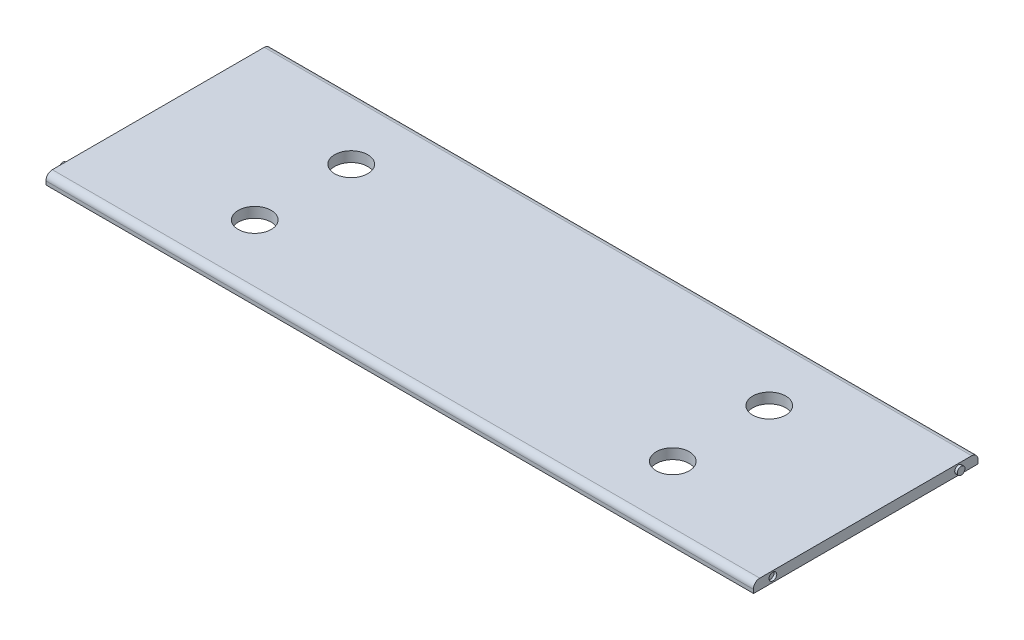
ISO-10303-21;
HEADER;
FILE_DESCRIPTION(('STEP AP214'),'2;1');
FILE_NAME('part.step','',(''),(''),'','','');
FILE_SCHEMA(('AUTOMOTIVE_DESIGN { 1 0 10303 214 1 1 1 1 }'));
ENDSEC;
DATA;
#1=APPLICATION_CONTEXT('core data for automotive mechanical design processes');
#2=APPLICATION_PROTOCOL_DEFINITION('international standard','automotive_design',2000,#1);
#3=PRODUCT_CONTEXT('',#1,'mechanical');
#4=PRODUCT('Part','Part','',(#3));
#5=PRODUCT_RELATED_PRODUCT_CATEGORY('part','',(#4));
#6=PRODUCT_DEFINITION_FORMATION('','',#4);
#7=PRODUCT_DEFINITION_CONTEXT('part definition',#1,'design');
#8=PRODUCT_DEFINITION('design','',#6,#7);
#9=PRODUCT_DEFINITION_SHAPE('','',#8);
#10=(LENGTH_UNIT() NAMED_UNIT(*) SI_UNIT(.MILLI.,.METRE.));
#11=(NAMED_UNIT(*) PLANE_ANGLE_UNIT() SI_UNIT($,.RADIAN.));
#12=(NAMED_UNIT(*) SI_UNIT($,.STERADIAN.) SOLID_ANGLE_UNIT());
#13=UNCERTAINTY_MEASURE_WITH_UNIT(LENGTH_MEASURE(1.E-05),#10,'distance_accuracy_value','');
#14=(GEOMETRIC_REPRESENTATION_CONTEXT(3) GLOBAL_UNCERTAINTY_ASSIGNED_CONTEXT((#13)) GLOBAL_UNIT_ASSIGNED_CONTEXT((#10,
#11,#12)) REPRESENTATION_CONTEXT('',''));
#15=CARTESIAN_POINT('',(0.,0.,0.));
#16=DIRECTION('',(0.,0.,1.));
#17=DIRECTION('',(1.,0.,0.));
#18=AXIS2_PLACEMENT_3D('',#15,#16,#17);
#19=CARTESIAN_POINT('',(-254.,215.9,22.225));
#20=DIRECTION('',(0.,0.0416305447121813,-0.999133073092352));
#21=DIRECTION('',(0.,0.999133073092352,0.0416305447121813));
#22=AXIS2_PLACEMENT_3D('',#19,#20,#21);
#23=PLANE('',#22);
#24=DIRECTION('',(0.,0.999133073092352,0.0416305447121813));
#25=VECTOR('',#24,1.);
#26=CARTESIAN_POINT('',(-69.85,215.899999999997,22.2249999999999));
#27=LINE('',#26,#25);
#28=CARTESIAN_POINT('',(-69.85,213.868,22.1403333333333));
#29=VERTEX_POINT('',#28);
#30=CARTESIAN_POINT('',(-69.85,214.603586624051,22.1709827760021));
#31=VERTEX_POINT('',#30);
#32=EDGE_CURVE('E60',#29,#31,#27,.T.);
#33=ORIENTED_EDGE('',*,*,#32,.F.);
#34=DIRECTION('',(1.,0.,0.));
#35=VECTOR('',#34,1.);
#36=CARTESIAN_POINT('',(0.,213.868,22.1403333333333));
#37=LINE('',#36,#35);
#38=CARTESIAN_POINT('',(69.8500000000001,213.868,22.1403333333333));
#39=VERTEX_POINT('',#38);
#40=EDGE_CURVE('E118',#29,#39,#37,.T.);
#41=ORIENTED_EDGE('',*,*,#40,.T.);
#42=DIRECTION('',(0.,-0.999133073092352,-0.0416305447121813));
#43=VECTOR('',#42,1.);
#44=CARTESIAN_POINT('',(69.85,215.900000000004,22.2250000000002));
#45=LINE('',#44,#43);
#46=CARTESIAN_POINT('',(69.85,214.603586624051,22.1709827760021));
#47=VERTEX_POINT('',#46);
#48=EDGE_CURVE('E135',#47,#39,#45,.T.);
#49=ORIENTED_EDGE('',*,*,#48,.F.);
#50=DIRECTION('',(-1.,0.,0.));
#51=VECTOR('',#50,1.);
#52=CARTESIAN_POINT('',(-254.,214.603586624051,22.1709827760021));
#53=LINE('',#52,#51);
#54=EDGE_CURVE('E109',#47,#31,#53,.T.);
#55=ORIENTED_EDGE('',*,*,#54,.T.);
#56=EDGE_LOOP('',(#33,#41,#49,#55));
#57=FACE_BOUND('',#56,.T.);
#58=ADVANCED_FACE('F35',(#57),#23,.F.);
#59=CARTESIAN_POINT('',(-254.,215.9,-22.225));
#60=DIRECTION('',(0.,0.0416305447121813,0.999133073092352));
#61=DIRECTION('',(0.,-0.999133073092352,0.0416305447121813));
#62=AXIS2_PLACEMENT_3D('',#59,#60,#61);
#63=PLANE('',#62);
#64=DIRECTION('',(0.,-0.999133073092352,0.0416305447121813));
#65=VECTOR('',#64,1.);
#66=CARTESIAN_POINT('',(-69.85,215.899999999997,-22.2249999999999));
#67=LINE('',#66,#65);
#68=CARTESIAN_POINT('',(-69.85,214.603586624051,-22.1709827760021));
#69=VERTEX_POINT('',#68);
#70=CARTESIAN_POINT('',(-69.85,213.868,-22.1403333333333));
#71=VERTEX_POINT('',#70);
#72=EDGE_CURVE('E138',#69,#71,#67,.T.);
#73=ORIENTED_EDGE('',*,*,#72,.F.);
#74=DIRECTION('',(-1.,0.,0.));
#75=VECTOR('',#74,1.);
#76=CARTESIAN_POINT('',(-254.,214.603586624051,-22.1709827760021));
#77=LINE('',#76,#75);
#78=CARTESIAN_POINT('',(69.85,214.603586624051,-22.1709827760021));
#79=VERTEX_POINT('',#78);
#80=EDGE_CURVE('E11',#69,#79,#77,.F.);
#81=ORIENTED_EDGE('',*,*,#80,.T.);
#82=DIRECTION('',(0.,0.999133073092352,-0.0416305447121813));
#83=VECTOR('',#82,1.);
#84=CARTESIAN_POINT('',(69.85,215.900000000004,-22.2250000000002));
#85=LINE('',#84,#83);
#86=CARTESIAN_POINT('',(69.85,213.868,-22.1403333333333));
#87=VERTEX_POINT('',#86);
#88=EDGE_CURVE('E137',#87,#79,#85,.T.);
#89=ORIENTED_EDGE('',*,*,#88,.F.);
#90=DIRECTION('',(-1.,0.,0.));
#91=VECTOR('',#90,1.);
#92=CARTESIAN_POINT('',(0.,213.868,-22.1403333333333));
#93=LINE('',#92,#91);
#94=EDGE_CURVE('E115',#87,#71,#93,.T.);
#95=ORIENTED_EDGE('',*,*,#94,.T.);
#96=EDGE_LOOP('',(#73,#81,#89,#95));
#97=FACE_BOUND('',#96,.T.);
#98=ADVANCED_FACE('F176',(#97),#63,.F.);
#99=CARTESIAN_POINT('',(0.,215.9,22.225));
#100=DIRECTION('',(0.,-1.,0.));
#101=DIRECTION('',(0.,0.,-1.));
#102=AXIS2_PLACEMENT_3D('',#99,#100,#101);
#103=PLANE('',#102);
#104=CARTESIAN_POINT('',(41.275,215.9,9.52500000000001));
#105=DIRECTION('',(0.,1.,0.));
#106=DIRECTION('',(0.,0.,1.));
#107=AXIS2_PLACEMENT_3D('',#104,#105,#106);
#108=CIRCLE('',#107,3.2639);
#109=CARTESIAN_POINT('',(41.275,215.9,12.7889));
#110=VERTEX_POINT('',#109);
#111=EDGE_CURVE('E140',#110,#110,#108,.T.);
#112=ORIENTED_EDGE('',*,*,#111,.F.);
#113=EDGE_LOOP('',(#112));
#114=FACE_BOUND('',#113,.T.);
#115=CARTESIAN_POINT('',(41.275,215.9,-9.52499999999999));
#116=DIRECTION('',(0.,1.,0.));
#117=DIRECTION('',(0.,0.,1.));
#118=AXIS2_PLACEMENT_3D('',#115,#116,#117);
#119=CIRCLE('',#118,3.2639);
#120=CARTESIAN_POINT('',(41.275,215.9,-6.26109999999999));
#121=VERTEX_POINT('',#120);
#122=EDGE_CURVE('E150',#121,#121,#119,.T.);
#123=ORIENTED_EDGE('',*,*,#122,.F.);
#124=EDGE_LOOP('',(#123));
#125=FACE_BOUND('',#124,.T.);
#126=CARTESIAN_POINT('',(-41.275,215.9,9.52500000000001));
#127=DIRECTION('',(0.,1.,0.));
#128=DIRECTION('',(0.,0.,1.));
#129=AXIS2_PLACEMENT_3D('',#126,#127,#128);
#130=CIRCLE('',#129,3.2639);
#131=CARTESIAN_POINT('',(-41.275,215.9,12.7889));
#132=VERTEX_POINT('',#131);
#133=EDGE_CURVE('E156',#132,#132,#130,.T.);
#134=ORIENTED_EDGE('',*,*,#133,.F.);
#135=EDGE_LOOP('',(#134));
#136=FACE_BOUND('',#135,.T.);
#137=CARTESIAN_POINT('',(-41.275,215.9,-9.52499999999999));
#138=DIRECTION('',(0.,1.,0.));
#139=DIRECTION('',(0.,0.,1.));
#140=AXIS2_PLACEMENT_3D('',#137,#138,#139);
#141=CIRCLE('',#140,3.2639);
#142=CARTESIAN_POINT('',(-41.275,215.9,-6.26109999999999));
#143=VERTEX_POINT('',#142);
#144=EDGE_CURVE('E161',#143,#143,#141,.T.);
#145=ORIENTED_EDGE('',*,*,#144,.F.);
#146=EDGE_LOOP('',(#145));
#147=FACE_BOUND('',#146,.T.);
#148=DIRECTION('',(0.,0.,-1.));
#149=VECTOR('',#148,1.);
#150=CARTESIAN_POINT('',(-69.85,215.9,22.225));
#151=LINE('',#150,#149);
#152=CARTESIAN_POINT('',(-69.85,215.9,20.9274617532314));
#153=VERTEX_POINT('',#152);
#154=CARTESIAN_POINT('',(-69.85,215.9,-20.9274617532314));
#155=VERTEX_POINT('',#154);
#156=EDGE_CURVE('E90',#153,#155,#151,.T.);
#157=ORIENTED_EDGE('',*,*,#156,.F.);
#158=DIRECTION('',(-1.,0.,0.));
#159=VECTOR('',#158,1.);
#160=CARTESIAN_POINT('',(0.,215.9,20.9274617532314));
#161=LINE('',#160,#159);
#162=CARTESIAN_POINT('',(69.85,215.9,20.9274617532314));
#163=VERTEX_POINT('',#162);
#164=EDGE_CURVE('E44',#153,#163,#161,.F.);
#165=ORIENTED_EDGE('',*,*,#164,.T.);
#166=DIRECTION('',(0.,0.,-1.));
#167=VECTOR('',#166,1.);
#168=CARTESIAN_POINT('',(69.85,215.9,22.225));
#169=LINE('',#168,#167);
#170=CARTESIAN_POINT('',(69.85,215.9,-20.9274617532314));
#171=VERTEX_POINT('',#170);
#172=EDGE_CURVE('E52',#163,#171,#169,.T.);
#173=ORIENTED_EDGE('',*,*,#172,.T.);
#174=DIRECTION('',(-1.,0.,0.));
#175=VECTOR('',#174,1.);
#176=CARTESIAN_POINT('',(0.,215.9,-20.9274617532314));
#177=LINE('',#176,#175);
#178=EDGE_CURVE('E103',#171,#155,#177,.T.);
#179=ORIENTED_EDGE('',*,*,#178,.T.);
#180=EDGE_LOOP('',(#157,#165,#173,#179));
#181=FACE_BOUND('',#180,.T.);
#182=ADVANCED_FACE('F101',(#114,#125,#136,#147,#181),#103,.F.);
#183=CARTESIAN_POINT('',(0.,213.868,22.225));
#184=DIRECTION('',(0.,-1.,0.));
#185=DIRECTION('',(0.,0.,-1.));
#186=AXIS2_PLACEMENT_3D('',#183,#184,#185);
#187=PLANE('',#186);
#188=CARTESIAN_POINT('',(41.275,213.868,9.52500000000001));
#189=DIRECTION('',(0.,-1.,0.));
#190=DIRECTION('',(0.,0.,-1.));
#191=AXIS2_PLACEMENT_3D('',#188,#189,#190);
#192=CIRCLE('',#191,3.2639);
#193=CARTESIAN_POINT('',(41.275,213.868,6.26110000000001));
#194=VERTEX_POINT('',#193);
#195=EDGE_CURVE('E147',#194,#194,#192,.T.);
#196=ORIENTED_EDGE('',*,*,#195,.F.);
#197=EDGE_LOOP('',(#196));
#198=FACE_BOUND('',#197,.T.);
#199=CARTESIAN_POINT('',(41.275,213.868,-9.52499999999999));
#200=DIRECTION('',(0.,-1.,0.));
#201=DIRECTION('',(0.,0.,-1.));
#202=AXIS2_PLACEMENT_3D('',#199,#200,#201);
#203=CIRCLE('',#202,3.2639);
#204=CARTESIAN_POINT('',(41.275,213.868,-12.7889));
#205=VERTEX_POINT('',#204);
#206=EDGE_CURVE('E153',#205,#205,#203,.T.);
#207=ORIENTED_EDGE('',*,*,#206,.F.);
#208=EDGE_LOOP('',(#207));
#209=FACE_BOUND('',#208,.T.);
#210=CARTESIAN_POINT('',(-41.275,213.868,9.52500000000001));
#211=DIRECTION('',(0.,-1.,0.));
#212=DIRECTION('',(0.,0.,-1.));
#213=AXIS2_PLACEMENT_3D('',#210,#211,#212);
#214=CIRCLE('',#213,3.2639);
#215=CARTESIAN_POINT('',(-41.275,213.868,6.26110000000001));
#216=VERTEX_POINT('',#215);
#217=EDGE_CURVE('E159',#216,#216,#214,.T.);
#218=ORIENTED_EDGE('',*,*,#217,.F.);
#219=EDGE_LOOP('',(#218));
#220=FACE_BOUND('',#219,.T.);
#221=CARTESIAN_POINT('',(-41.275,213.868,-9.52499999999999));
#222=DIRECTION('',(0.,-1.,0.));
#223=DIRECTION('',(0.,0.,-1.));
#224=AXIS2_PLACEMENT_3D('',#221,#222,#223);
#225=CIRCLE('',#224,3.2639);
#226=CARTESIAN_POINT('',(-41.275,213.868,-12.7889));
#227=VERTEX_POINT('',#226);
#228=EDGE_CURVE('E97',#227,#227,#225,.T.);
#229=ORIENTED_EDGE('',*,*,#228,.F.);
#230=EDGE_LOOP('',(#229));
#231=FACE_BOUND('',#230,.T.);
#232=ORIENTED_EDGE('',*,*,#94,.F.);
#233=DIRECTION('',(0.,0.,-1.));
#234=VECTOR('',#233,1.);
#235=CARTESIAN_POINT('',(69.85,213.868,22.225));
#236=LINE('',#235,#234);
#237=EDGE_CURVE('E125',#39,#87,#236,.T.);
#238=ORIENTED_EDGE('',*,*,#237,.F.);
#239=ORIENTED_EDGE('',*,*,#40,.F.);
#240=DIRECTION('',(0.,0.,-1.));
#241=VECTOR('',#240,1.);
#242=CARTESIAN_POINT('',(-69.85,213.868,22.225));
#243=LINE('',#242,#241);
#244=EDGE_CURVE('E105',#29,#71,#243,.T.);
#245=ORIENTED_EDGE('',*,*,#244,.T.);
#246=EDGE_LOOP('',(#232,#238,#239,#245));
#247=FACE_BOUND('',#246,.T.);
#248=ADVANCED_FACE('F170',(#198,#209,#220,#231,#247),#187,.T.);
#249=CARTESIAN_POINT('',(0.,214.6554,-20.9274617532314));
#250=DIRECTION('',(-1.,0.,0.));
#251=DIRECTION('',(0.,0.,1.));
#252=AXIS2_PLACEMENT_3D('',#249,#250,#251);
#253=CYLINDRICAL_SURFACE('',#252,1.2446);
#254=CARTESIAN_POINT('',(-69.85,214.6554,-20.9274617532314));
#255=DIRECTION('',(-1.,0.,0.));
#256=DIRECTION('',(0.,0.,1.));
#257=AXIS2_PLACEMENT_3D('',#254,#255,#256);
#258=CIRCLE('',#257,1.2446);
#259=EDGE_CURVE('E113',#155,#69,#258,.T.);
#260=ORIENTED_EDGE('',*,*,#259,.F.);
#261=ORIENTED_EDGE('',*,*,#178,.F.);
#262=CARTESIAN_POINT('',(69.85,214.6554,-20.9274617532314));
#263=DIRECTION('',(1.,0.,0.));
#264=DIRECTION('',(0.,0.,-1.));
#265=AXIS2_PLACEMENT_3D('',#262,#263,#264);
#266=CIRCLE('',#265,1.2446);
#267=EDGE_CURVE('E39',#79,#171,#266,.T.);
#268=ORIENTED_EDGE('',*,*,#267,.F.);
#269=ORIENTED_EDGE('',*,*,#80,.F.);
#270=EDGE_LOOP('',(#260,#261,#268,#269));
#271=FACE_BOUND('',#270,.T.);
#272=ADVANCED_FACE('F37',(#271),#253,.T.);
#273=CARTESIAN_POINT('',(-254.,214.6554,20.9274617532314));
#274=DIRECTION('',(-1.,0.,0.));
#275=DIRECTION('',(0.,0.,1.));
#276=AXIS2_PLACEMENT_3D('',#273,#274,#275);
#277=CYLINDRICAL_SURFACE('',#276,1.2446);
#278=CARTESIAN_POINT('',(69.85,214.6554,20.9274617532314));
#279=DIRECTION('',(-1.,0.,0.));
#280=DIRECTION('',(0.,0.,1.));
#281=AXIS2_PLACEMENT_3D('',#278,#279,#280);
#282=CIRCLE('',#281,1.2446);
#283=EDGE_CURVE('E96',#47,#163,#282,.T.);
#284=ORIENTED_EDGE('',*,*,#283,.T.);
#285=ORIENTED_EDGE('',*,*,#164,.F.);
#286=CARTESIAN_POINT('',(-69.85,214.6554,20.9274617532314));
#287=DIRECTION('',(1.,0.,0.));
#288=DIRECTION('',(0.,0.,-1.));
#289=AXIS2_PLACEMENT_3D('',#286,#287,#288);
#290=CIRCLE('',#289,1.2446);
#291=EDGE_CURVE('E87',#153,#31,#290,.T.);
#292=ORIENTED_EDGE('',*,*,#291,.T.);
#293=ORIENTED_EDGE('',*,*,#54,.F.);
#294=EDGE_LOOP('',(#284,#285,#292,#293));
#295=FACE_BOUND('',#294,.T.);
#296=ADVANCED_FACE('F107',(#295),#277,.T.);
#297=CARTESIAN_POINT('',(-41.275,215.9,-9.52499999999999));
#298=DIRECTION('',(0.,1.,0.));
#299=DIRECTION('',(0.,0.,1.));
#300=AXIS2_PLACEMENT_3D('',#297,#298,#299);
#301=CYLINDRICAL_SURFACE('',#300,3.2639);
#302=ORIENTED_EDGE('',*,*,#228,.T.);
#303=EDGE_LOOP('',(#302));
#304=FACE_BOUND('',#303,.T.);
#305=ORIENTED_EDGE('',*,*,#144,.T.);
#306=EDGE_LOOP('',(#305));
#307=FACE_BOUND('',#306,.T.);
#308=ADVANCED_FACE('F168',(#304,#307),#301,.F.);
#309=CARTESIAN_POINT('',(-41.275,215.9,9.52500000000001));
#310=DIRECTION('',(0.,1.,0.));
#311=DIRECTION('',(0.,0.,1.));
#312=AXIS2_PLACEMENT_3D('',#309,#310,#311);
#313=CYLINDRICAL_SURFACE('',#312,3.2639);
#314=ORIENTED_EDGE('',*,*,#217,.T.);
#315=EDGE_LOOP('',(#314));
#316=FACE_BOUND('',#315,.T.);
#317=ORIENTED_EDGE('',*,*,#133,.T.);
#318=EDGE_LOOP('',(#317));
#319=FACE_BOUND('',#318,.T.);
#320=ADVANCED_FACE('F201',(#316,#319),#313,.F.);
#321=CARTESIAN_POINT('',(41.275,215.9,-9.52499999999999));
#322=DIRECTION('',(0.,1.,0.));
#323=DIRECTION('',(0.,0.,1.));
#324=AXIS2_PLACEMENT_3D('',#321,#322,#323);
#325=CYLINDRICAL_SURFACE('',#324,3.2639);
#326=ORIENTED_EDGE('',*,*,#206,.T.);
#327=EDGE_LOOP('',(#326));
#328=FACE_BOUND('',#327,.T.);
#329=ORIENTED_EDGE('',*,*,#122,.T.);
#330=EDGE_LOOP('',(#329));
#331=FACE_BOUND('',#330,.T.);
#332=ADVANCED_FACE('F203',(#328,#331),#325,.F.);
#333=CARTESIAN_POINT('',(41.275,215.9,9.52500000000001));
#334=DIRECTION('',(0.,1.,0.));
#335=DIRECTION('',(0.,0.,1.));
#336=AXIS2_PLACEMENT_3D('',#333,#334,#335);
#337=CYLINDRICAL_SURFACE('',#336,3.2639);
#338=ORIENTED_EDGE('',*,*,#195,.T.);
#339=EDGE_LOOP('',(#338));
#340=FACE_BOUND('',#339,.T.);
#341=ORIENTED_EDGE('',*,*,#111,.T.);
#342=EDGE_LOOP('',(#341));
#343=FACE_BOUND('',#342,.T.);
#344=ADVANCED_FACE('F210',(#340,#343),#337,.F.);
#345=CARTESIAN_POINT('',(69.8500000000029,9.56811605375907E-13,0.));
#346=DIRECTION('',(1.,0.,0.));
#347=DIRECTION('',(0.,1.,0.));
#348=AXIS2_PLACEMENT_3D('',#345,#346,#347);
#349=PLANE('',#348);
#350=CARTESIAN_POINT('',(69.85,214.884,18.3303333333333));
#351=DIRECTION('',(1.,0.,0.));
#352=DIRECTION('',(0.,1.,0.));
#353=AXIS2_PLACEMENT_3D('',#350,#351,#352);
#354=CIRCLE('',#353,0.761999999999989);
#355=CARTESIAN_POINT('',(69.85,215.646,18.3303333333333));
#356=VERTEX_POINT('',#355);
#357=EDGE_CURVE('E270',#356,#356,#354,.T.);
#358=ORIENTED_EDGE('',*,*,#357,.F.);
#359=EDGE_LOOP('',(#358));
#360=FACE_BOUND('',#359,.T.);
#361=CARTESIAN_POINT('',(69.85,214.884,-18.3303333333333));
#362=DIRECTION('',(1.,0.,0.));
#363=DIRECTION('',(0.,1.,0.));
#364=AXIS2_PLACEMENT_3D('',#361,#362,#363);
#365=CIRCLE('',#364,0.761999999999989);
#366=CARTESIAN_POINT('',(69.85,215.646,-18.3303333333333));
#367=VERTEX_POINT('',#366);
#368=EDGE_CURVE('E275',#367,#367,#365,.T.);
#369=ORIENTED_EDGE('',*,*,#368,.F.);
#370=EDGE_LOOP('',(#369));
#371=FACE_BOUND('',#370,.T.);
#372=ORIENTED_EDGE('',*,*,#88,.T.);
#373=ORIENTED_EDGE('',*,*,#267,.T.);
#374=ORIENTED_EDGE('',*,*,#172,.F.);
#375=ORIENTED_EDGE('',*,*,#283,.F.);
#376=ORIENTED_EDGE('',*,*,#48,.T.);
#377=ORIENTED_EDGE('',*,*,#237,.T.);
#378=EDGE_LOOP('',(#372,#373,#374,#375,#376,#377));
#379=FACE_BOUND('',#378,.T.);
#380=ADVANCED_FACE('F216',(#360,#371,#379),#349,.T.);
#381=CARTESIAN_POINT('',(-69.8500000000029,9.51563038668067E-13,0.));
#382=DIRECTION('',(-1.,0.,0.));
#383=DIRECTION('',(0.,-1.,0.));
#384=AXIS2_PLACEMENT_3D('',#381,#382,#383);
#385=PLANE('',#384);
#386=CARTESIAN_POINT('',(-69.85,214.884,18.3303333333333));
#387=DIRECTION('',(-1.,0.,0.));
#388=DIRECTION('',(0.,-1.,0.));
#389=AXIS2_PLACEMENT_3D('',#386,#387,#388);
#390=CIRCLE('',#389,0.761999999999989);
#391=CARTESIAN_POINT('',(-69.85,214.122,18.3303333333333));
#392=VERTEX_POINT('',#391);
#393=EDGE_CURVE('E261',#392,#392,#390,.T.);
#394=ORIENTED_EDGE('',*,*,#393,.F.);
#395=EDGE_LOOP('',(#394));
#396=FACE_BOUND('',#395,.T.);
#397=CARTESIAN_POINT('',(-69.85,214.884,-18.3303333333333));
#398=DIRECTION('',(-1.,0.,0.));
#399=DIRECTION('',(0.,-1.,0.));
#400=AXIS2_PLACEMENT_3D('',#397,#398,#399);
#401=CIRCLE('',#400,0.761999999999989);
#402=CARTESIAN_POINT('',(-69.85,214.122,-18.3303333333333));
#403=VERTEX_POINT('',#402);
#404=EDGE_CURVE('E260',#403,#403,#401,.T.);
#405=ORIENTED_EDGE('',*,*,#404,.F.);
#406=EDGE_LOOP('',(#405));
#407=FACE_BOUND('',#406,.T.);
#408=ORIENTED_EDGE('',*,*,#72,.T.);
#409=ORIENTED_EDGE('',*,*,#244,.F.);
#410=ORIENTED_EDGE('',*,*,#32,.T.);
#411=ORIENTED_EDGE('',*,*,#291,.F.);
#412=ORIENTED_EDGE('',*,*,#156,.T.);
#413=ORIENTED_EDGE('',*,*,#259,.T.);
#414=EDGE_LOOP('',(#408,#409,#410,#411,#412,#413));
#415=FACE_BOUND('',#414,.T.);
#416=ADVANCED_FACE('F89',(#396,#407,#415),#385,.T.);
#417=CARTESIAN_POINT('',(70.358,214.884,-18.3303333333333));
#418=DIRECTION('',(-1.,0.,0.));
#419=DIRECTION('',(0.,-1.,0.));
#420=AXIS2_PLACEMENT_3D('',#417,#418,#419);
#421=CYLINDRICAL_SURFACE('',#420,0.761999999999989);
#422=CARTESIAN_POINT('',(70.358,214.884,-18.3303333333333));
#423=DIRECTION('',(1.,0.,0.));
#424=DIRECTION('',(0.,1.,0.));
#425=AXIS2_PLACEMENT_3D('',#422,#423,#424);
#426=CIRCLE('',#425,0.761999999999989);
#427=CARTESIAN_POINT('',(70.358,215.646,-18.3303333333333));
#428=VERTEX_POINT('',#427);
#429=EDGE_CURVE('E278',#428,#428,#426,.T.);
#430=ORIENTED_EDGE('',*,*,#429,.F.);
#431=EDGE_LOOP('',(#430));
#432=FACE_BOUND('',#431,.T.);
#433=ORIENTED_EDGE('',*,*,#368,.T.);
#434=EDGE_LOOP('',(#433));
#435=FACE_BOUND('',#434,.T.);
#436=ADVANCED_FACE('F223',(#432,#435),#421,.T.);
#437=CARTESIAN_POINT('',(70.358,214.884,-18.3303333333333));
#438=DIRECTION('',(1.,0.,0.));
#439=DIRECTION('',(0.,1.,0.));
#440=AXIS2_PLACEMENT_3D('',#437,#438,#439);
#441=PLANE('',#440);
#442=ORIENTED_EDGE('',*,*,#429,.T.);
#443=EDGE_LOOP('',(#442));
#444=FACE_BOUND('',#443,.T.);
#445=ADVANCED_FACE('F227',(#444),#441,.T.);
#446=CARTESIAN_POINT('',(69.342,214.884,18.3303333333333));
#447=DIRECTION('',(1.,0.,0.));
#448=DIRECTION('',(0.,1.,0.));
#449=AXIS2_PLACEMENT_3D('',#446,#447,#448);
#450=CYLINDRICAL_SURFACE('',#449,0.761999999999989);
#451=CARTESIAN_POINT('',(69.342,214.884,18.3303333333333));
#452=DIRECTION('',(1.,0.,0.));
#453=DIRECTION('',(0.,1.,0.));
#454=AXIS2_PLACEMENT_3D('',#451,#452,#453);
#455=CIRCLE('',#454,0.761999999999989);
#456=CARTESIAN_POINT('',(69.342,215.646,18.3303333333333));
#457=VERTEX_POINT('',#456);
#458=EDGE_CURVE('E272',#457,#457,#455,.T.);
#459=ORIENTED_EDGE('',*,*,#458,.F.);
#460=EDGE_LOOP('',(#459));
#461=FACE_BOUND('',#460,.T.);
#462=ORIENTED_EDGE('',*,*,#357,.T.);
#463=EDGE_LOOP('',(#462));
#464=FACE_BOUND('',#463,.T.);
#465=ADVANCED_FACE('F231',(#461,#464),#450,.F.);
#466=CARTESIAN_POINT('',(69.342,214.884,18.3303333333333));
#467=DIRECTION('',(1.,0.,0.));
#468=DIRECTION('',(0.,1.,0.));
#469=AXIS2_PLACEMENT_3D('',#466,#467,#468);
#470=PLANE('',#469);
#471=ORIENTED_EDGE('',*,*,#458,.T.);
#472=EDGE_LOOP('',(#471));
#473=FACE_BOUND('',#472,.T.);
#474=ADVANCED_FACE('F235',(#473),#470,.T.);
#475=CARTESIAN_POINT('',(-69.342,214.884,-18.3303333333333));
#476=DIRECTION('',(-1.,0.,0.));
#477=DIRECTION('',(0.,-1.,0.));
#478=AXIS2_PLACEMENT_3D('',#475,#476,#477);
#479=CYLINDRICAL_SURFACE('',#478,0.761999999999989);
#480=CARTESIAN_POINT('',(-69.342,214.884,-18.3303333333333));
#481=DIRECTION('',(-1.,0.,0.));
#482=DIRECTION('',(0.,-1.,0.));
#483=AXIS2_PLACEMENT_3D('',#480,#481,#482);
#484=CIRCLE('',#483,0.761999999999989);
#485=CARTESIAN_POINT('',(-69.342,214.122,-18.3303333333333));
#486=VERTEX_POINT('',#485);
#487=EDGE_CURVE('E264',#486,#486,#484,.T.);
#488=ORIENTED_EDGE('',*,*,#487,.F.);
#489=EDGE_LOOP('',(#488));
#490=FACE_BOUND('',#489,.T.);
#491=ORIENTED_EDGE('',*,*,#404,.T.);
#492=EDGE_LOOP('',(#491));
#493=FACE_BOUND('',#492,.T.);
#494=ADVANCED_FACE('F239',(#490,#493),#479,.F.);
#495=CARTESIAN_POINT('',(-69.342,214.884,-18.3303333333333));
#496=DIRECTION('',(-1.,0.,0.));
#497=DIRECTION('',(0.,-1.,0.));
#498=AXIS2_PLACEMENT_3D('',#495,#496,#497);
#499=PLANE('',#498);
#500=ORIENTED_EDGE('',*,*,#487,.T.);
#501=EDGE_LOOP('',(#500));
#502=FACE_BOUND('',#501,.T.);
#503=ADVANCED_FACE('F243',(#502),#499,.T.);
#504=CARTESIAN_POINT('',(-70.358,214.884,18.3303333333333));
#505=DIRECTION('',(1.,0.,0.));
#506=DIRECTION('',(0.,1.,0.));
#507=AXIS2_PLACEMENT_3D('',#504,#505,#506);
#508=CYLINDRICAL_SURFACE('',#507,0.761999999999989);
#509=CARTESIAN_POINT('',(-70.358,214.884,18.3303333333333));
#510=DIRECTION('',(-1.,0.,0.));
#511=DIRECTION('',(0.,-1.,0.));
#512=AXIS2_PLACEMENT_3D('',#509,#510,#511);
#513=CIRCLE('',#512,0.761999999999989);
#514=CARTESIAN_POINT('',(-70.358,214.122,18.3303333333333));
#515=VERTEX_POINT('',#514);
#516=EDGE_CURVE('E259',#515,#515,#513,.T.);
#517=ORIENTED_EDGE('',*,*,#516,.F.);
#518=EDGE_LOOP('',(#517));
#519=FACE_BOUND('',#518,.T.);
#520=ORIENTED_EDGE('',*,*,#393,.T.);
#521=EDGE_LOOP('',(#520));
#522=FACE_BOUND('',#521,.T.);
#523=ADVANCED_FACE('F247',(#519,#522),#508,.T.);
#524=CARTESIAN_POINT('',(-70.358,214.884,18.3303333333333));
#525=DIRECTION('',(-1.,0.,0.));
#526=DIRECTION('',(0.,-1.,0.));
#527=AXIS2_PLACEMENT_3D('',#524,#525,#526);
#528=PLANE('',#527);
#529=ORIENTED_EDGE('',*,*,#516,.T.);
#530=EDGE_LOOP('',(#529));
#531=FACE_BOUND('',#530,.T.);
#532=ADVANCED_FACE('F251',(#531),#528,.T.);
#533=CLOSED_SHELL('',(#58,#98,#182,#248,#272,#296,#308,#320,#332,#344,#380,#416,#436,#445,#465,
#474,#494,#503,#523,#532));
#534=MANIFOLD_SOLID_BREP('B2',#533);
#535=ADVANCED_BREP_SHAPE_REPRESENTATION('',(#18,#534),#14);
#536=SHAPE_DEFINITION_REPRESENTATION(#9,#535);
ENDSEC;
END-ISO-10303-21;
